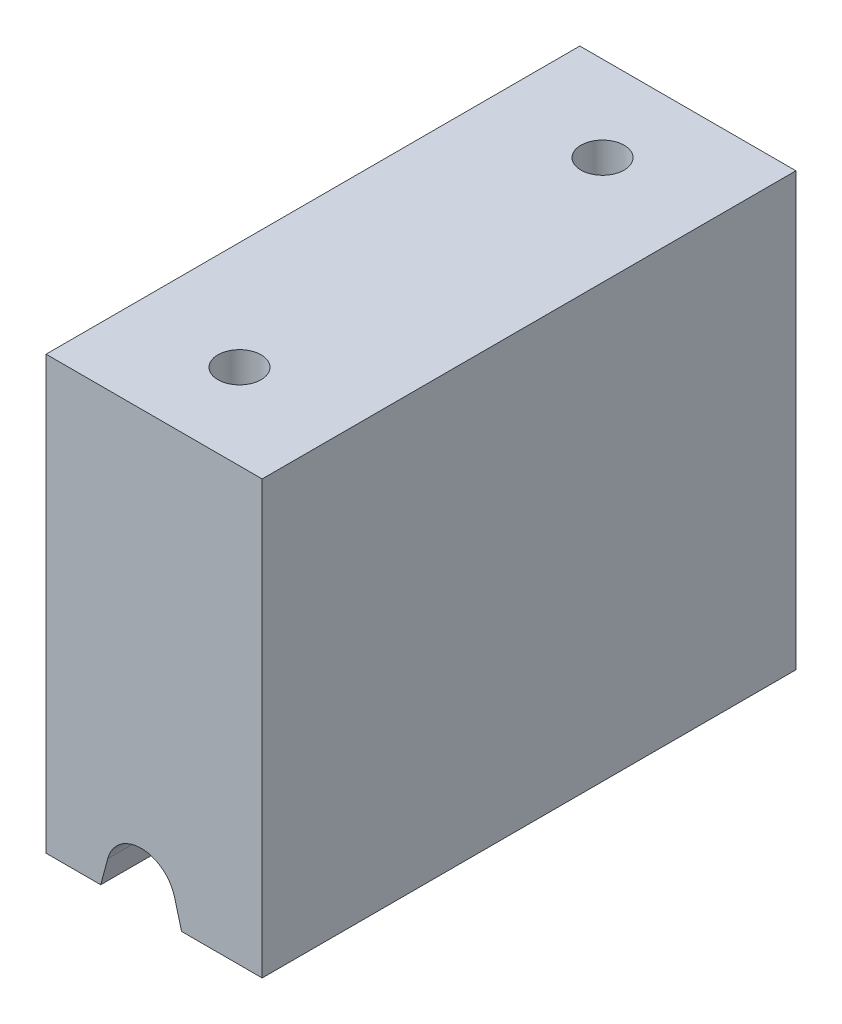
ISO-10303-21;
HEADER;
FILE_DESCRIPTION(('STEP AP214'),'2;1');
FILE_NAME('part.step','',(''),(''),'','','');
FILE_SCHEMA(('AUTOMOTIVE_DESIGN { 1 0 10303 214 1 1 1 1 }'));
ENDSEC;
DATA;
#1=APPLICATION_CONTEXT('core data for automotive mechanical design processes');
#2=APPLICATION_PROTOCOL_DEFINITION('international standard','automotive_design',2000,#1);
#3=PRODUCT_CONTEXT('',#1,'mechanical');
#4=PRODUCT('Part','Part','',(#3));
#5=PRODUCT_RELATED_PRODUCT_CATEGORY('part','',(#4));
#6=PRODUCT_DEFINITION_FORMATION('','',#4);
#7=PRODUCT_DEFINITION_CONTEXT('part definition',#1,'design');
#8=PRODUCT_DEFINITION('design','',#6,#7);
#9=PRODUCT_DEFINITION_SHAPE('','',#8);
#10=(LENGTH_UNIT() NAMED_UNIT(*) SI_UNIT(.MILLI.,.METRE.));
#11=(NAMED_UNIT(*) PLANE_ANGLE_UNIT() SI_UNIT($,.RADIAN.));
#12=(NAMED_UNIT(*) SI_UNIT($,.STERADIAN.) SOLID_ANGLE_UNIT());
#13=UNCERTAINTY_MEASURE_WITH_UNIT(LENGTH_MEASURE(1.E-05),#10,'distance_accuracy_value','');
#14=(GEOMETRIC_REPRESENTATION_CONTEXT(3) GLOBAL_UNCERTAINTY_ASSIGNED_CONTEXT((#13)) GLOBAL_UNIT_ASSIGNED_CONTEXT((#10,
#11,#12)) REPRESENTATION_CONTEXT('',''));
#15=CARTESIAN_POINT('',(0.,0.,0.));
#16=DIRECTION('',(0.,0.,1.));
#17=DIRECTION('',(1.,0.,0.));
#18=AXIS2_PLACEMENT_3D('',#15,#16,#17);
#19=CARTESIAN_POINT('',(-12.5,-50.,30.875));
#20=DIRECTION('',(0.,1.,0.));
#21=DIRECTION('',(-1.,0.,0.));
#22=AXIS2_PLACEMENT_3D('',#19,#20,#21);
#23=PLANE('',#22);
#24=DIRECTION('',(1.,0.,0.));
#25=VECTOR('',#24,1.);
#26=CARTESIAN_POINT('',(-12.5,-50.,-30.875));
#27=LINE('',#26,#25);
#28=CARTESIAN_POINT('',(-12.5,-50.,-30.875));
#29=VERTEX_POINT('',#28);
#30=CARTESIAN_POINT('',(-6.17700310650259,-50.,-30.875));
#31=VERTEX_POINT('',#30);
#32=EDGE_CURVE('E184',#29,#31,#27,.T.);
#33=ORIENTED_EDGE('',*,*,#32,.T.);
#34=DIRECTION('',(0.,0.,-1.));
#35=VECTOR('',#34,1.);
#36=CARTESIAN_POINT('',(-6.17700310650259,-50.,30.876));
#37=LINE('',#36,#35);
#38=CARTESIAN_POINT('',(-6.17700310650259,-50.,30.875));
#39=VERTEX_POINT('',#38);
#40=EDGE_CURVE('E164',#39,#31,#37,.T.);
#41=ORIENTED_EDGE('',*,*,#40,.F.);
#42=DIRECTION('',(1.,0.,0.));
#43=VECTOR('',#42,1.);
#44=CARTESIAN_POINT('',(-12.5,-50.,30.875));
#45=LINE('',#44,#43);
#46=CARTESIAN_POINT('',(-12.5,-50.,30.875));
#47=VERTEX_POINT('',#46);
#48=EDGE_CURVE('E101',#47,#39,#45,.T.);
#49=ORIENTED_EDGE('',*,*,#48,.F.);
#50=DIRECTION('',(0.,0.,-1.));
#51=VECTOR('',#50,1.);
#52=CARTESIAN_POINT('',(-12.5,-50.,30.875));
#53=LINE('',#52,#51);
#54=EDGE_CURVE('E11',#47,#29,#53,.T.);
#55=ORIENTED_EDGE('',*,*,#54,.T.);
#56=EDGE_LOOP('',(#33,#41,#49,#55));
#57=FACE_BOUND('',#56,.T.);
#58=ADVANCED_FACE('F49',(#57),#23,.F.);
#59=CARTESIAN_POINT('',(-12.5,-50.,30.875));
#60=DIRECTION('',(1.,0.,0.));
#61=DIRECTION('',(0.,1.,0.));
#62=AXIS2_PLACEMENT_3D('',#59,#60,#61);
#63=PLANE('',#62);
#64=DIRECTION('',(0.,-1.,0.));
#65=VECTOR('',#64,1.);
#66=CARTESIAN_POINT('',(-12.5,-50.,-30.875));
#67=LINE('',#66,#65);
#68=CARTESIAN_POINT('',(-12.5,0.,-30.875));
#69=VERTEX_POINT('',#68);
#70=EDGE_CURVE('E172',#69,#29,#67,.T.);
#71=ORIENTED_EDGE('',*,*,#70,.T.);
#72=ORIENTED_EDGE('',*,*,#54,.F.);
#73=DIRECTION('',(0.,-1.,0.));
#74=VECTOR('',#73,1.);
#75=CARTESIAN_POINT('',(-12.5,-50.,30.875));
#76=LINE('',#75,#74);
#77=CARTESIAN_POINT('',(-12.5,0.,30.875));
#78=VERTEX_POINT('',#77);
#79=EDGE_CURVE('E173',#78,#47,#76,.T.);
#80=ORIENTED_EDGE('',*,*,#79,.F.);
#81=DIRECTION('',(0.,0.,-1.));
#82=VECTOR('',#81,1.);
#83=CARTESIAN_POINT('',(-12.5,0.,30.875));
#84=LINE('',#83,#82);
#85=EDGE_CURVE('E180',#78,#69,#84,.T.);
#86=ORIENTED_EDGE('',*,*,#85,.T.);
#87=EDGE_LOOP('',(#71,#72,#80,#86));
#88=FACE_BOUND('',#87,.T.);
#89=ADVANCED_FACE('F51',(#88),#63,.F.);
#90=CARTESIAN_POINT('',(3.17700310650258,-50.,30.875));
#91=VERTEX_POINT('',#90);
#92=CARTESIAN_POINT('',(12.5,-50.,30.875));
#93=VERTEX_POINT('',#92);
#94=EDGE_CURVE('E175',#91,#93,#45,.T.);
#95=ORIENTED_EDGE('',*,*,#94,.F.);
#96=DIRECTION('',(0.,0.,-1.));
#97=VECTOR('',#96,1.);
#98=CARTESIAN_POINT('',(3.17700310650258,-50.,30.876));
#99=LINE('',#98,#97);
#100=CARTESIAN_POINT('',(3.17700310650258,-50.,-30.875));
#101=VERTEX_POINT('',#100);
#102=EDGE_CURVE('E166',#91,#101,#99,.T.);
#103=ORIENTED_EDGE('',*,*,#102,.T.);
#104=CARTESIAN_POINT('',(12.5,-50.,-30.875));
#105=VERTEX_POINT('',#104);
#106=EDGE_CURVE('E183',#101,#105,#27,.T.);
#107=ORIENTED_EDGE('',*,*,#106,.T.);
#108=DIRECTION('',(0.,0.,-1.));
#109=VECTOR('',#108,1.);
#110=CARTESIAN_POINT('',(12.5,-50.,30.875));
#111=LINE('',#110,#109);
#112=EDGE_CURVE('E57',#93,#105,#111,.T.);
#113=ORIENTED_EDGE('',*,*,#112,.F.);
#114=EDGE_LOOP('',(#95,#103,#107,#113));
#115=FACE_BOUND('',#114,.T.);
#116=ADVANCED_FACE('F221',(#115),#23,.F.);
#117=CARTESIAN_POINT('',(12.5,-50.,30.875));
#118=DIRECTION('',(-1.,0.,0.));
#119=DIRECTION('',(0.,-1.,0.));
#120=AXIS2_PLACEMENT_3D('',#117,#118,#119);
#121=PLANE('',#120);
#122=DIRECTION('',(0.,1.,0.));
#123=VECTOR('',#122,1.);
#124=CARTESIAN_POINT('',(12.5,-50.,-30.875));
#125=LINE('',#124,#123);
#126=CARTESIAN_POINT('',(12.5,0.,-30.875));
#127=VERTEX_POINT('',#126);
#128=EDGE_CURVE('E187',#105,#127,#125,.T.);
#129=ORIENTED_EDGE('',*,*,#128,.T.);
#130=DIRECTION('',(0.,0.,-1.));
#131=VECTOR('',#130,1.);
#132=CARTESIAN_POINT('',(12.5,0.,30.875));
#133=LINE('',#132,#131);
#134=CARTESIAN_POINT('',(12.5,0.,30.875));
#135=VERTEX_POINT('',#134);
#136=EDGE_CURVE('E191',#135,#127,#133,.T.);
#137=ORIENTED_EDGE('',*,*,#136,.F.);
#138=DIRECTION('',(0.,1.,0.));
#139=VECTOR('',#138,1.);
#140=CARTESIAN_POINT('',(12.5,-50.,30.875));
#141=LINE('',#140,#139);
#142=EDGE_CURVE('E177',#93,#135,#141,.T.);
#143=ORIENTED_EDGE('',*,*,#142,.F.);
#144=ORIENTED_EDGE('',*,*,#112,.T.);
#145=EDGE_LOOP('',(#129,#137,#143,#144));
#146=FACE_BOUND('',#145,.T.);
#147=ADVANCED_FACE('F197',(#146),#121,.F.);
#148=CARTESIAN_POINT('',(-12.5,0.,30.875));
#149=DIRECTION('',(0.,-1.,0.));
#150=DIRECTION('',(1.,0.,0.));
#151=AXIS2_PLACEMENT_3D('',#148,#149,#150);
#152=PLANE('',#151);
#153=CARTESIAN_POINT('',(0.,0.,-21.));
#154=DIRECTION('',(0.,1.,0.));
#155=DIRECTION('',(0.,0.,1.));
#156=AXIS2_PLACEMENT_3D('',#153,#154,#155);
#157=CIRCLE('',#156,2.49999999999999);
#158=CARTESIAN_POINT('',(0.,0.,-18.5));
#159=VERTEX_POINT('',#158);
#160=EDGE_CURVE('E139',#159,#159,#157,.T.);
#161=ORIENTED_EDGE('',*,*,#160,.F.);
#162=EDGE_LOOP('',(#161));
#163=FACE_BOUND('',#162,.T.);
#164=CARTESIAN_POINT('',(0.,0.,21.));
#165=DIRECTION('',(0.,1.,0.));
#166=DIRECTION('',(0.,0.,1.));
#167=AXIS2_PLACEMENT_3D('',#164,#165,#166);
#168=CIRCLE('',#167,2.49999999999999);
#169=CARTESIAN_POINT('',(0.,0.,23.5));
#170=VERTEX_POINT('',#169);
#171=EDGE_CURVE('E138',#170,#170,#168,.T.);
#172=ORIENTED_EDGE('',*,*,#171,.F.);
#173=EDGE_LOOP('',(#172));
#174=FACE_BOUND('',#173,.T.);
#175=DIRECTION('',(-1.,0.,0.));
#176=VECTOR('',#175,1.);
#177=CARTESIAN_POINT('',(-12.5,0.,-30.875));
#178=LINE('',#177,#176);
#179=EDGE_CURVE('E94',#127,#69,#178,.T.);
#180=ORIENTED_EDGE('',*,*,#179,.T.);
#181=ORIENTED_EDGE('',*,*,#85,.F.);
#182=DIRECTION('',(-1.,0.,0.));
#183=VECTOR('',#182,1.);
#184=CARTESIAN_POINT('',(-12.5,0.,30.875));
#185=LINE('',#184,#183);
#186=EDGE_CURVE('E73',#135,#78,#185,.T.);
#187=ORIENTED_EDGE('',*,*,#186,.F.);
#188=ORIENTED_EDGE('',*,*,#136,.T.);
#189=EDGE_LOOP('',(#180,#181,#187,#188));
#190=FACE_BOUND('',#189,.T.);
#191=ADVANCED_FACE('F210',(#163,#174,#190),#152,.F.);
#192=CARTESIAN_POINT('',(0.,0.,30.875));
#193=DIRECTION('',(0.,0.,-1.));
#194=DIRECTION('',(-1.,0.,0.));
#195=AXIS2_PLACEMENT_3D('',#192,#193,#194);
#196=PLANE('',#195);
#197=ORIENTED_EDGE('',*,*,#48,.T.);
#198=DIRECTION('',(-0.258819045102522,-0.965925826289068,0.));
#199=VECTOR('',#198,1.);
#200=CARTESIAN_POINT('',(-5.36370330515628,-46.9647238195899,30.875));
#201=LINE('',#200,#199);
#202=CARTESIAN_POINT('',(-5.36370330515628,-46.9647238195899,30.875));
#203=VERTEX_POINT('',#202);
#204=EDGE_CURVE('E152',#203,#39,#201,.T.);
#205=ORIENTED_EDGE('',*,*,#204,.F.);
#206=CARTESIAN_POINT('',(-1.50000000000001,-48.,30.875));
#207=DIRECTION('',(0.,0.,-1.));
#208=DIRECTION('',(-1.,0.,0.));
#209=AXIS2_PLACEMENT_3D('',#206,#207,#208);
#210=CIRCLE('',#209,4.);
#211=CARTESIAN_POINT('',(2.36370330515627,-46.9647238195899,30.875));
#212=VERTEX_POINT('',#211);
#213=EDGE_CURVE('E149',#212,#203,#210,.F.);
#214=ORIENTED_EDGE('',*,*,#213,.F.);
#215=DIRECTION('',(-0.258819045102521,0.965925826289068,0.));
#216=VECTOR('',#215,1.);
#217=CARTESIAN_POINT('',(2.36370330515627,-46.9647238195899,30.875));
#218=LINE('',#217,#216);
#219=EDGE_CURVE('E163',#91,#212,#218,.T.);
#220=ORIENTED_EDGE('',*,*,#219,.F.);
#221=ORIENTED_EDGE('',*,*,#94,.T.);
#222=ORIENTED_EDGE('',*,*,#142,.T.);
#223=ORIENTED_EDGE('',*,*,#186,.T.);
#224=ORIENTED_EDGE('',*,*,#79,.T.);
#225=EDGE_LOOP('',(#197,#205,#214,#220,#221,#222,#223,#224));
#226=FACE_BOUND('',#225,.T.);
#227=ADVANCED_FACE('F212',(#226),#196,.F.);
#228=CARTESIAN_POINT('',(0.,0.,-30.875));
#229=DIRECTION('',(0.,0.,-1.));
#230=DIRECTION('',(-1.,0.,0.));
#231=AXIS2_PLACEMENT_3D('',#228,#229,#230);
#232=PLANE('',#231);
#233=DIRECTION('',(0.258819045102522,0.965925826289068,0.));
#234=VECTOR('',#233,1.);
#235=CARTESIAN_POINT('',(-5.36370330515628,-46.9647238195899,-30.875));
#236=LINE('',#235,#234);
#237=CARTESIAN_POINT('',(-5.36370330515628,-46.9647238195899,-30.875));
#238=VERTEX_POINT('',#237);
#239=EDGE_CURVE('E157',#31,#238,#236,.T.);
#240=ORIENTED_EDGE('',*,*,#239,.F.);
#241=ORIENTED_EDGE('',*,*,#32,.F.);
#242=ORIENTED_EDGE('',*,*,#70,.F.);
#243=ORIENTED_EDGE('',*,*,#179,.F.);
#244=ORIENTED_EDGE('',*,*,#128,.F.);
#245=ORIENTED_EDGE('',*,*,#106,.F.);
#246=DIRECTION('',(0.258819045102521,-0.965925826289068,0.));
#247=VECTOR('',#246,1.);
#248=CARTESIAN_POINT('',(2.36370330515627,-46.9647238195899,-30.875));
#249=LINE('',#248,#247);
#250=CARTESIAN_POINT('',(2.36370330515627,-46.9647238195899,-30.875));
#251=VERTEX_POINT('',#250);
#252=EDGE_CURVE('E155',#251,#101,#249,.T.);
#253=ORIENTED_EDGE('',*,*,#252,.F.);
#254=CARTESIAN_POINT('',(-1.50000000000001,-48.,-30.875));
#255=DIRECTION('',(0.,0.,-1.));
#256=DIRECTION('',(-1.,0.,0.));
#257=AXIS2_PLACEMENT_3D('',#254,#255,#256);
#258=CIRCLE('',#257,4.);
#259=EDGE_CURVE('E64',#238,#251,#258,.T.);
#260=ORIENTED_EDGE('',*,*,#259,.F.);
#261=EDGE_LOOP('',(#240,#241,#242,#243,#244,#245,#253,#260));
#262=FACE_BOUND('',#261,.T.);
#263=ADVANCED_FACE('F204',(#262),#232,.T.);
#264=CARTESIAN_POINT('',(-1.50000000000001,-48.,30.876));
#265=DIRECTION('',(0.,0.,-1.));
#266=DIRECTION('',(-1.,0.,0.));
#267=AXIS2_PLACEMENT_3D('',#264,#265,#266);
#268=CYLINDRICAL_SURFACE('',#267,4.);
#269=ORIENTED_EDGE('',*,*,#213,.T.);
#270=DIRECTION('',(0.,0.,-1.));
#271=VECTOR('',#270,1.);
#272=CARTESIAN_POINT('',(-5.36370330515628,-46.9647238195899,30.876));
#273=LINE('',#272,#271);
#274=EDGE_CURVE('E161',#203,#238,#273,.T.);
#275=ORIENTED_EDGE('',*,*,#274,.T.);
#276=ORIENTED_EDGE('',*,*,#259,.T.);
#277=DIRECTION('',(0.,0.,-1.));
#278=VECTOR('',#277,1.);
#279=CARTESIAN_POINT('',(2.36370330515627,-46.9647238195899,30.876));
#280=LINE('',#279,#278);
#281=EDGE_CURVE('E160',#212,#251,#280,.T.);
#282=ORIENTED_EDGE('',*,*,#281,.F.);
#283=EDGE_LOOP('',(#269,#275,#276,#282));
#284=FACE_BOUND('',#283,.T.);
#285=ADVANCED_FACE('F240',(#284),#268,.F.);
#286=CARTESIAN_POINT('',(-5.36370330515628,-46.9647238195899,30.876));
#287=DIRECTION('',(-0.965925826289068,0.258819045102522,0.));
#288=DIRECTION('',(-0.258819045102522,-0.965925826289068,0.));
#289=AXIS2_PLACEMENT_3D('',#286,#287,#288);
#290=PLANE('',#289);
#291=ORIENTED_EDGE('',*,*,#204,.T.);
#292=ORIENTED_EDGE('',*,*,#40,.T.);
#293=ORIENTED_EDGE('',*,*,#239,.T.);
#294=ORIENTED_EDGE('',*,*,#274,.F.);
#295=EDGE_LOOP('',(#291,#292,#293,#294));
#296=FACE_BOUND('',#295,.T.);
#297=ADVANCED_FACE('F239',(#296),#290,.F.);
#298=CARTESIAN_POINT('',(2.36370330515627,-46.9647238195899,30.876));
#299=DIRECTION('',(0.965925826289068,0.258819045102521,0.));
#300=DIRECTION('',(-0.258819045102521,0.965925826289068,0.));
#301=AXIS2_PLACEMENT_3D('',#298,#299,#300);
#302=PLANE('',#301);
#303=ORIENTED_EDGE('',*,*,#219,.T.);
#304=ORIENTED_EDGE('',*,*,#281,.T.);
#305=ORIENTED_EDGE('',*,*,#252,.T.);
#306=ORIENTED_EDGE('',*,*,#102,.F.);
#307=EDGE_LOOP('',(#303,#304,#305,#306));
#308=FACE_BOUND('',#307,.T.);
#309=ADVANCED_FACE('F237',(#308),#302,.F.);
#310=CARTESIAN_POINT('',(0.,-17.,21.));
#311=DIRECTION('',(0.,1.,0.));
#312=DIRECTION('',(0.,0.,1.));
#313=AXIS2_PLACEMENT_3D('',#310,#311,#312);
#314=CONICAL_SURFACE('',#313,2.49999999999999,1.02974425867665);
#315=CARTESIAN_POINT('',(0.,-18.5021515475689,21.));
#316=VERTEX_POINT('',#315);
#317=VERTEX_LOOP('',#316);
#318=FACE_BOUND('',#317,.T.);
#319=CARTESIAN_POINT('',(0.,-17.,21.));
#320=DIRECTION('',(0.,1.,0.));
#321=DIRECTION('',(0.,0.,1.));
#322=AXIS2_PLACEMENT_3D('',#319,#320,#321);
#323=CIRCLE('',#322,2.49999999999999);
#324=CARTESIAN_POINT('',(0.,-17.,23.5));
#325=VERTEX_POINT('',#324);
#326=EDGE_CURVE('E142',#325,#325,#323,.T.);
#327=ORIENTED_EDGE('',*,*,#326,.T.);
#328=EDGE_LOOP('',(#327));
#329=FACE_BOUND('',#328,.T.);
#330=ADVANCED_FACE('F250',(#318,#329),#314,.F.);
#331=CARTESIAN_POINT('',(0.,0.,21.));
#332=DIRECTION('',(0.,1.,0.));
#333=DIRECTION('',(0.,0.,1.));
#334=AXIS2_PLACEMENT_3D('',#331,#332,#333);
#335=CYLINDRICAL_SURFACE('',#334,2.49999999999999);
#336=ORIENTED_EDGE('',*,*,#326,.F.);
#337=EDGE_LOOP('',(#336));
#338=FACE_BOUND('',#337,.T.);
#339=ORIENTED_EDGE('',*,*,#171,.T.);
#340=EDGE_LOOP('',(#339));
#341=FACE_BOUND('',#340,.T.);
#342=ADVANCED_FACE('F132',(#338,#341),#335,.F.);
#343=CARTESIAN_POINT('',(0.,-17.,-21.));
#344=DIRECTION('',(0.,1.,0.));
#345=DIRECTION('',(0.,0.,1.));
#346=AXIS2_PLACEMENT_3D('',#343,#344,#345);
#347=CONICAL_SURFACE('',#346,2.49999999999999,1.02974425867665);
#348=CARTESIAN_POINT('',(0.,-18.5021515475689,-21.));
#349=VERTEX_POINT('',#348);
#350=VERTEX_LOOP('',#349);
#351=FACE_BOUND('',#350,.T.);
#352=CARTESIAN_POINT('',(0.,-17.,-21.));
#353=DIRECTION('',(0.,1.,0.));
#354=DIRECTION('',(0.,0.,1.));
#355=AXIS2_PLACEMENT_3D('',#352,#353,#354);
#356=CIRCLE('',#355,2.49999999999999);
#357=CARTESIAN_POINT('',(0.,-17.,-18.5));
#358=VERTEX_POINT('',#357);
#359=EDGE_CURVE('E136',#358,#358,#356,.T.);
#360=ORIENTED_EDGE('',*,*,#359,.T.);
#361=EDGE_LOOP('',(#360));
#362=FACE_BOUND('',#361,.T.);
#363=ADVANCED_FACE('F128',(#351,#362),#347,.F.);
#364=CARTESIAN_POINT('',(0.,0.,-21.));
#365=DIRECTION('',(0.,1.,0.));
#366=DIRECTION('',(0.,0.,1.));
#367=AXIS2_PLACEMENT_3D('',#364,#365,#366);
#368=CYLINDRICAL_SURFACE('',#367,2.49999999999999);
#369=ORIENTED_EDGE('',*,*,#359,.F.);
#370=EDGE_LOOP('',(#369));
#371=FACE_BOUND('',#370,.T.);
#372=ORIENTED_EDGE('',*,*,#160,.T.);
#373=EDGE_LOOP('',(#372));
#374=FACE_BOUND('',#373,.T.);
#375=ADVANCED_FACE('F131',(#371,#374),#368,.F.);
#376=CLOSED_SHELL('',(#58,#89,#116,#147,#191,#227,#263,#285,#297,#309,#330,#342,#363,#375));
#377=MANIFOLD_SOLID_BREP('B2',#376);
#378=ADVANCED_BREP_SHAPE_REPRESENTATION('',(#18,#377),#14);
#379=SHAPE_DEFINITION_REPRESENTATION(#9,#378);
ENDSEC;
END-ISO-10303-21;
